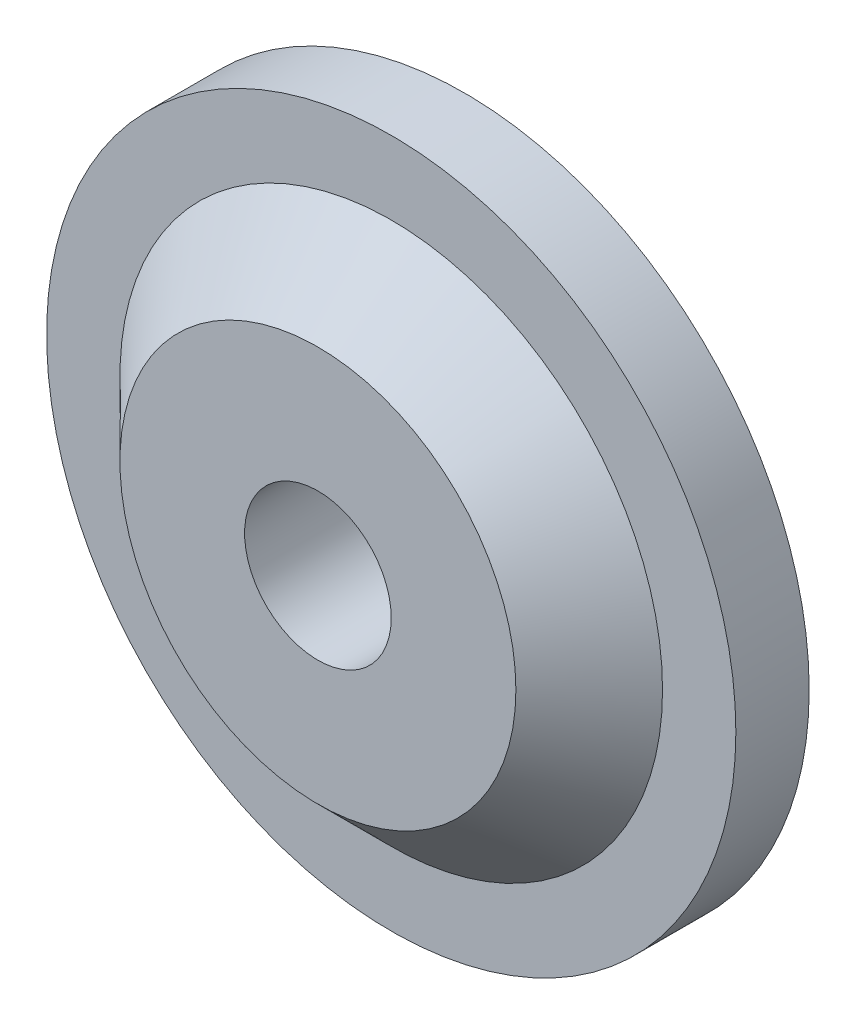
ISO-10303-21;
HEADER;
FILE_DESCRIPTION(('STEP AP214'),'2;1');
FILE_NAME('part.step','',(''),(''),'','','');
FILE_SCHEMA(('AUTOMOTIVE_DESIGN { 1 0 10303 214 1 1 1 1 }'));
ENDSEC;
DATA;
#1=APPLICATION_CONTEXT('core data for automotive mechanical design processes');
#2=APPLICATION_PROTOCOL_DEFINITION('international standard','automotive_design',2000,#1);
#3=PRODUCT_CONTEXT('',#1,'mechanical');
#4=PRODUCT('Part','Part','',(#3));
#5=PRODUCT_RELATED_PRODUCT_CATEGORY('part','',(#4));
#6=PRODUCT_DEFINITION_FORMATION('','',#4);
#7=PRODUCT_DEFINITION_CONTEXT('part definition',#1,'design');
#8=PRODUCT_DEFINITION('design','',#6,#7);
#9=PRODUCT_DEFINITION_SHAPE('','',#8);
#10=(LENGTH_UNIT() NAMED_UNIT(*) SI_UNIT(.MILLI.,.METRE.));
#11=(NAMED_UNIT(*) PLANE_ANGLE_UNIT() SI_UNIT($,.RADIAN.));
#12=(NAMED_UNIT(*) SI_UNIT($,.STERADIAN.) SOLID_ANGLE_UNIT());
#13=UNCERTAINTY_MEASURE_WITH_UNIT(LENGTH_MEASURE(1.E-05),#10,'distance_accuracy_value','');
#14=(GEOMETRIC_REPRESENTATION_CONTEXT(3) GLOBAL_UNCERTAINTY_ASSIGNED_CONTEXT((#13)) GLOBAL_UNIT_ASSIGNED_CONTEXT((#10,
#11,#12)) REPRESENTATION_CONTEXT('',''));
#15=CARTESIAN_POINT('',(0.,0.,0.));
#16=DIRECTION('',(0.,0.,1.));
#17=DIRECTION('',(1.,0.,0.));
#18=AXIS2_PLACEMENT_3D('',#15,#16,#17);
#19=CARTESIAN_POINT('',(0.,0.,6.35));
#20=DIRECTION('',(0.,0.,1.));
#21=DIRECTION('',(1.,0.,0.));
#22=AXIS2_PLACEMENT_3D('',#19,#20,#21);
#23=PLANE('',#22);
#24=CARTESIAN_POINT('',(0.,0.,6.35));
#25=DIRECTION('',(0.,0.,1.));
#26=DIRECTION('',(1.,0.,0.));
#27=AXIS2_PLACEMENT_3D('',#24,#25,#26);
#28=CIRCLE('',#27,3.175);
#29=CARTESIAN_POINT('',(3.175,0.,6.35));
#30=VERTEX_POINT('',#29);
#31=EDGE_CURVE('E39',#30,#30,#28,.T.);
#32=ORIENTED_EDGE('',*,*,#31,.F.);
#33=EDGE_LOOP('',(#32));
#34=FACE_BOUND('',#33,.T.);
#35=CARTESIAN_POINT('',(0.,0.,6.35));
#36=DIRECTION('',(0.,0.,1.));
#37=DIRECTION('',(1.,0.,0.));
#38=AXIS2_PLACEMENT_3D('',#35,#36,#37);
#39=CIRCLE('',#38,8.57249999999996);
#40=CARTESIAN_POINT('',(8.57249999999996,0.,6.35));
#41=VERTEX_POINT('',#40);
#42=EDGE_CURVE('E48',#41,#41,#39,.T.);
#43=ORIENTED_EDGE('',*,*,#42,.T.);
#44=EDGE_LOOP('',(#43));
#45=FACE_BOUND('',#44,.T.);
#46=ADVANCED_FACE('F32',(#34,#45),#23,.T.);
#47=CARTESIAN_POINT('',(0.,0.,6.35));
#48=DIRECTION('',(0.,0.,-1.));
#49=DIRECTION('',(-1.,0.,0.));
#50=AXIS2_PLACEMENT_3D('',#47,#48,#49);
#51=CYLINDRICAL_SURFACE('',#50,14.9225);
#52=CARTESIAN_POINT('',(0.,0.,0.));
#53=DIRECTION('',(0.,0.,1.));
#54=DIRECTION('',(1.,0.,0.));
#55=AXIS2_PLACEMENT_3D('',#52,#53,#54);
#56=CIRCLE('',#55,14.9225);
#57=CARTESIAN_POINT('',(14.9225,0.,0.));
#58=VERTEX_POINT('',#57);
#59=EDGE_CURVE('E10',#58,#58,#56,.T.);
#60=ORIENTED_EDGE('',*,*,#59,.T.);
#61=EDGE_LOOP('',(#60));
#62=FACE_BOUND('',#61,.T.);
#63=CARTESIAN_POINT('',(0.,0.,3.17499999999999));
#64=DIRECTION('',(0.,0.,1.));
#65=DIRECTION('',(1.,0.,0.));
#66=AXIS2_PLACEMENT_3D('',#63,#64,#65);
#67=CIRCLE('',#66,14.9225);
#68=CARTESIAN_POINT('',(14.9225,0.,3.17499999999999));
#69=VERTEX_POINT('',#68);
#70=EDGE_CURVE('E55',#69,#69,#67,.T.);
#71=ORIENTED_EDGE('',*,*,#70,.F.);
#72=EDGE_LOOP('',(#71));
#73=FACE_BOUND('',#72,.T.);
#74=ADVANCED_FACE('F34',(#62,#73),#51,.T.);
#75=CARTESIAN_POINT('',(0.,0.,0.));
#76=DIRECTION('',(0.,0.,1.));
#77=DIRECTION('',(1.,0.,0.));
#78=AXIS2_PLACEMENT_3D('',#75,#76,#77);
#79=PLANE('',#78);
#80=ORIENTED_EDGE('',*,*,#59,.F.);
#81=EDGE_LOOP('',(#80));
#82=FACE_BOUND('',#81,.T.);
#83=CARTESIAN_POINT('',(0.,0.,0.));
#84=DIRECTION('',(0.,0.,1.));
#85=DIRECTION('',(1.,0.,0.));
#86=AXIS2_PLACEMENT_3D('',#83,#84,#85);
#87=CIRCLE('',#86,3.175);
#88=CARTESIAN_POINT('',(3.175,0.,0.));
#89=VERTEX_POINT('',#88);
#90=EDGE_CURVE('E43',#89,#89,#87,.T.);
#91=ORIENTED_EDGE('',*,*,#90,.T.);
#92=EDGE_LOOP('',(#91));
#93=FACE_BOUND('',#92,.T.);
#94=ADVANCED_FACE('F63',(#82,#93),#79,.F.);
#95=CARTESIAN_POINT('',(0.,0.,6.35));
#96=DIRECTION('',(0.,0.,-1.));
#97=DIRECTION('',(-1.,0.,0.));
#98=AXIS2_PLACEMENT_3D('',#95,#96,#97);
#99=CYLINDRICAL_SURFACE('',#98,3.175);
#100=ORIENTED_EDGE('',*,*,#31,.T.);
#101=EDGE_LOOP('',(#100));
#102=FACE_BOUND('',#101,.T.);
#103=ORIENTED_EDGE('',*,*,#90,.F.);
#104=EDGE_LOOP('',(#103));
#105=FACE_BOUND('',#104,.T.);
#106=ADVANCED_FACE('F68',(#102,#105),#99,.F.);
#107=CARTESIAN_POINT('',(0.,0.,6.35));
#108=DIRECTION('',(0.,0.,-1.));
#109=DIRECTION('',(-1.,0.,0.));
#110=AXIS2_PLACEMENT_3D('',#107,#108,#109);
#111=CONICAL_SURFACE('',#110,8.57249999999996,0.785398163397454);
#112=CARTESIAN_POINT('',(0.,0.,3.17499999999999));
#113=DIRECTION('',(0.,0.,1.));
#114=DIRECTION('',(1.,0.,0.));
#115=AXIS2_PLACEMENT_3D('',#112,#113,#114);
#116=CIRCLE('',#115,11.7475);
#117=CARTESIAN_POINT('',(11.7475,0.,3.17499999999999));
#118=VERTEX_POINT('',#117);
#119=EDGE_CURVE('E52',#118,#118,#116,.T.);
#120=ORIENTED_EDGE('',*,*,#119,.T.);
#121=EDGE_LOOP('',(#120));
#122=FACE_BOUND('',#121,.T.);
#123=ORIENTED_EDGE('',*,*,#42,.F.);
#124=EDGE_LOOP('',(#123));
#125=FACE_BOUND('',#124,.T.);
#126=ADVANCED_FACE('F78',(#122,#125),#111,.T.);
#127=CARTESIAN_POINT('',(0.,14.9225,3.17499999999999));
#128=DIRECTION('',(0.,0.,1.));
#129=DIRECTION('',(1.,0.,0.));
#130=AXIS2_PLACEMENT_3D('',#127,#128,#129);
#131=PLANE('',#130);
#132=ORIENTED_EDGE('',*,*,#70,.T.);
#133=EDGE_LOOP('',(#132));
#134=FACE_BOUND('',#133,.T.);
#135=ORIENTED_EDGE('',*,*,#119,.F.);
#136=EDGE_LOOP('',(#135));
#137=FACE_BOUND('',#136,.T.);
#138=ADVANCED_FACE('F59',(#134,#137),#131,.T.);
#139=CLOSED_SHELL('',(#46,#74,#94,#106,#126,#138));
#140=MANIFOLD_SOLID_BREP('B2',#139);
#141=ADVANCED_BREP_SHAPE_REPRESENTATION('',(#18,#140),#14);
#142=SHAPE_DEFINITION_REPRESENTATION(#9,#141);
ENDSEC;
END-ISO-10303-21;
